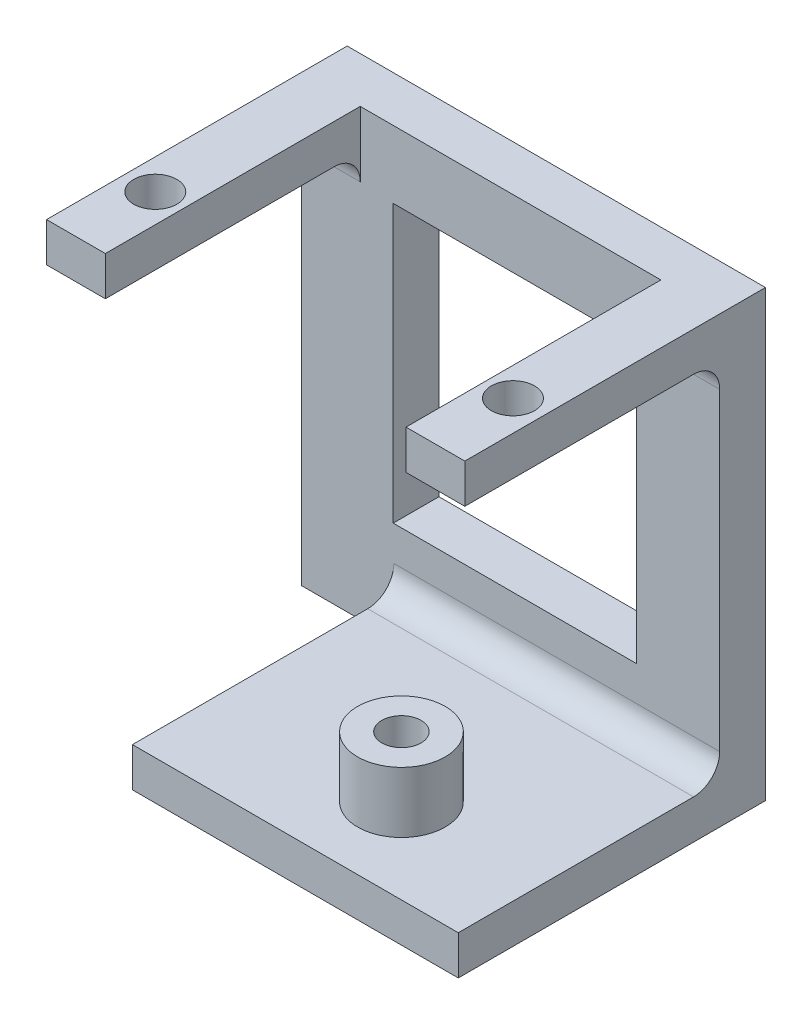
ISO-10303-21;
HEADER;
FILE_DESCRIPTION(('STEP AP214'),'2;1');
FILE_NAME('part.step','',(''),(''),'','','');
FILE_SCHEMA(('AUTOMOTIVE_DESIGN { 1 0 10303 214 1 1 1 1 }'));
ENDSEC;
DATA;
#1=APPLICATION_CONTEXT('core data for automotive mechanical design processes');
#2=APPLICATION_PROTOCOL_DEFINITION('international standard','automotive_design',2000,#1);
#3=PRODUCT_CONTEXT('',#1,'mechanical');
#4=PRODUCT('Part','Part','',(#3));
#5=PRODUCT_RELATED_PRODUCT_CATEGORY('part','',(#4));
#6=PRODUCT_DEFINITION_FORMATION('','',#4);
#7=PRODUCT_DEFINITION_CONTEXT('part definition',#1,'design');
#8=PRODUCT_DEFINITION('design','',#6,#7);
#9=PRODUCT_DEFINITION_SHAPE('','',#8);
#10=(LENGTH_UNIT() NAMED_UNIT(*) SI_UNIT(.MILLI.,.METRE.));
#11=(NAMED_UNIT(*) PLANE_ANGLE_UNIT() SI_UNIT($,.RADIAN.));
#12=(NAMED_UNIT(*) SI_UNIT($,.STERADIAN.) SOLID_ANGLE_UNIT());
#13=UNCERTAINTY_MEASURE_WITH_UNIT(LENGTH_MEASURE(1.E-05),#10,'distance_accuracy_value','');
#14=(GEOMETRIC_REPRESENTATION_CONTEXT(3) GLOBAL_UNCERTAINTY_ASSIGNED_CONTEXT((#13)) GLOBAL_UNIT_ASSIGNED_CONTEXT((#10,
#11,#12)) REPRESENTATION_CONTEXT('',''));
#15=CARTESIAN_POINT('',(0.,0.,0.));
#16=DIRECTION('',(0.,0.,1.));
#17=DIRECTION('',(1.,0.,0.));
#18=AXIS2_PLACEMENT_3D('',#15,#16,#17);
#19=CARTESIAN_POINT('',(16.,-32.5,-13.5));
#20=DIRECTION('',(0.,0.,-1.));
#21=DIRECTION('',(-1.,0.,0.));
#22=AXIS2_PLACEMENT_3D('',#19,#20,#21);
#23=PLANE('',#22);
#24=DIRECTION('',(1.,0.,0.));
#25=VECTOR('',#24,1.);
#26=CARTESIAN_POINT('',(16.,-3.66719670015137,-13.5));
#27=LINE('',#26,#25);
#28=CARTESIAN_POINT('',(-8.97905357841466,-3.66719670015137,-13.5));
#29=VERTEX_POINT('',#28);
#30=CARTESIAN_POINT('',(9.62765777511265,-3.66719670015137,-13.5));
#31=VERTEX_POINT('',#30);
#32=EDGE_CURVE('E393',#29,#31,#27,.T.);
#33=ORIENTED_EDGE('',*,*,#32,.T.);
#34=DIRECTION('',(0.,-1.,0.));
#35=VECTOR('',#34,1.);
#36=CARTESIAN_POINT('',(9.62765777511265,-32.5,-13.5));
#37=LINE('',#36,#35);
#38=CARTESIAN_POINT('',(9.62765777511265,-24.8523813533321,-13.5));
#39=VERTEX_POINT('',#38);
#40=EDGE_CURVE('E396',#31,#39,#37,.T.);
#41=ORIENTED_EDGE('',*,*,#40,.T.);
#42=DIRECTION('',(-1.,0.,0.));
#43=VECTOR('',#42,1.);
#44=CARTESIAN_POINT('',(16.,-24.8523813533321,-13.5));
#45=LINE('',#44,#43);
#46=CARTESIAN_POINT('',(-8.97905357841466,-24.8523813533321,-13.5));
#47=VERTEX_POINT('',#46);
#48=EDGE_CURVE('E387',#39,#47,#45,.T.);
#49=ORIENTED_EDGE('',*,*,#48,.T.);
#50=DIRECTION('',(0.,1.,0.));
#51=VECTOR('',#50,1.);
#52=CARTESIAN_POINT('',(-8.97905357841466,-32.5,-13.5));
#53=LINE('',#52,#51);
#54=EDGE_CURVE('E390',#47,#29,#53,.T.);
#55=ORIENTED_EDGE('',*,*,#54,.T.);
#56=EDGE_LOOP('',(#33,#41,#49,#55));
#57=FACE_BOUND('',#56,.T.);
#58=DIRECTION('',(0.,1.,0.));
#59=VECTOR('',#58,1.);
#60=CARTESIAN_POINT('',(-8.93022142127009,-39.5,-13.5));
#61=LINE('',#60,#59);
#62=CARTESIAN_POINT('',(-8.93022142127009,-32.5,-13.5));
#63=VERTEX_POINT('',#62);
#64=CARTESIAN_POINT('',(-8.93022142127009,-27.5,-13.5));
#65=VERTEX_POINT('',#64);
#66=EDGE_CURVE('E199',#63,#65,#61,.T.);
#67=ORIENTED_EDGE('',*,*,#66,.T.);
#68=DIRECTION('',(-1.,0.,0.));
#69=VECTOR('',#68,1.);
#70=CARTESIAN_POINT('',(16.,-27.5,-13.5));
#71=LINE('',#70,#69);
#72=CARTESIAN_POINT('',(16.,-27.5,-13.5));
#73=VERTEX_POINT('',#72);
#74=EDGE_CURVE('E304',#65,#73,#71,.F.);
#75=ORIENTED_EDGE('',*,*,#74,.T.);
#76=DIRECTION('',(0.,1.,0.));
#77=VECTOR('',#76,1.);
#78=CARTESIAN_POINT('',(16.,-32.5,-13.5));
#79=LINE('',#78,#77);
#80=CARTESIAN_POINT('',(16.,-3.5,-13.5));
#81=VERTEX_POINT('',#80);
#82=EDGE_CURVE('E256',#73,#81,#79,.T.);
#83=ORIENTED_EDGE('',*,*,#82,.T.);
#84=DIRECTION('',(-1.,0.,0.));
#85=VECTOR('',#84,1.);
#86=CARTESIAN_POINT('',(11.5,-3.5,-13.5));
#87=LINE('',#86,#85);
#88=CARTESIAN_POINT('',(11.5,-3.5,-13.5));
#89=VERTEX_POINT('',#88);
#90=EDGE_CURVE('E301',#81,#89,#87,.T.);
#91=ORIENTED_EDGE('',*,*,#90,.T.);
#92=DIRECTION('',(0.,-1.,0.));
#93=VECTOR('',#92,1.);
#94=CARTESIAN_POINT('',(11.5,1.5,-13.5));
#95=LINE('',#94,#93);
#96=CARTESIAN_POINT('',(11.5,1.5,-13.5));
#97=VERTEX_POINT('',#96);
#98=EDGE_CURVE('E216',#97,#89,#95,.T.);
#99=ORIENTED_EDGE('',*,*,#98,.F.);
#100=DIRECTION('',(-1.,0.,0.));
#101=VECTOR('',#100,1.);
#102=CARTESIAN_POINT('',(16.002,1.5,-13.5));
#103=LINE('',#102,#101);
#104=CARTESIAN_POINT('',(-11.5,1.5,-13.5));
#105=VERTEX_POINT('',#104);
#106=EDGE_CURVE('E214',#97,#105,#103,.T.);
#107=ORIENTED_EDGE('',*,*,#106,.T.);
#108=DIRECTION('',(0.,-1.,0.));
#109=VECTOR('',#108,1.);
#110=CARTESIAN_POINT('',(-11.5,1.5,-13.5));
#111=LINE('',#110,#109);
#112=CARTESIAN_POINT('',(-11.5,-3.5,-13.5));
#113=VERTEX_POINT('',#112);
#114=EDGE_CURVE('E207',#105,#113,#111,.T.);
#115=ORIENTED_EDGE('',*,*,#114,.T.);
#116=DIRECTION('',(-1.,0.,0.));
#117=VECTOR('',#116,1.);
#118=CARTESIAN_POINT('',(-16.,-3.5,-13.5));
#119=LINE('',#118,#117);
#120=CARTESIAN_POINT('',(-16.,-3.5,-13.5));
#121=VERTEX_POINT('',#120);
#122=EDGE_CURVE('E298',#113,#121,#119,.T.);
#123=ORIENTED_EDGE('',*,*,#122,.T.);
#124=DIRECTION('',(0.,1.,0.));
#125=VECTOR('',#124,1.);
#126=CARTESIAN_POINT('',(-16.,-32.5,-13.5));
#127=LINE('',#126,#125);
#128=CARTESIAN_POINT('',(-16.,-32.5,-13.5));
#129=VERTEX_POINT('',#128);
#130=EDGE_CURVE('E254',#129,#121,#127,.T.);
#131=ORIENTED_EDGE('',*,*,#130,.F.);
#132=DIRECTION('',(-1.,0.,0.));
#133=VECTOR('',#132,1.);
#134=CARTESIAN_POINT('',(0.,-32.5,-13.5));
#135=LINE('',#134,#133);
#136=EDGE_CURVE('E361',#63,#129,#135,.T.);
#137=ORIENTED_EDGE('',*,*,#136,.F.);
#138=EDGE_LOOP('',(#67,#75,#83,#91,#99,#107,#115,#123,#131,#137));
#139=FACE_BOUND('',#138,.T.);
#140=ADVANCED_FACE('F41',(#57,#139),#23,.F.);
#141=CARTESIAN_POINT('',(-11.5,1.5,-17.));
#142=DIRECTION('',(-1.,0.,0.));
#143=DIRECTION('',(0.,0.,1.));
#144=AXIS2_PLACEMENT_3D('',#141,#142,#143);
#145=PLANE('',#144);
#146=ORIENTED_EDGE('',*,*,#114,.F.);
#147=DIRECTION('',(0.,0.,-1.));
#148=VECTOR('',#147,1.);
#149=CARTESIAN_POINT('',(-11.5,1.5,-17.));
#150=LINE('',#149,#148);
#151=CARTESIAN_POINT('',(-11.5,1.5,6.));
#152=VERTEX_POINT('',#151);
#153=EDGE_CURVE('E272',#152,#105,#150,.T.);
#154=ORIENTED_EDGE('',*,*,#153,.F.);
#155=DIRECTION('',(0.,-1.,0.));
#156=VECTOR('',#155,1.);
#157=CARTESIAN_POINT('',(-11.5,1.5,6.));
#158=LINE('',#157,#156);
#159=CARTESIAN_POINT('',(-11.5,-1.5,6.));
#160=VERTEX_POINT('',#159);
#161=EDGE_CURVE('E284',#152,#160,#158,.T.);
#162=ORIENTED_EDGE('',*,*,#161,.T.);
#163=DIRECTION('',(0.,0.,-1.));
#164=VECTOR('',#163,1.);
#165=CARTESIAN_POINT('',(-11.5,-1.5,-17.));
#166=LINE('',#165,#164);
#167=CARTESIAN_POINT('',(-11.5,-1.5,-11.5));
#168=VERTEX_POINT('',#167);
#169=EDGE_CURVE('E270',#160,#168,#166,.T.);
#170=ORIENTED_EDGE('',*,*,#169,.T.);
#171=CARTESIAN_POINT('',(-11.5,-3.5,-11.5));
#172=DIRECTION('',(-1.,0.,0.));
#173=DIRECTION('',(0.,0.,1.));
#174=AXIS2_PLACEMENT_3D('',#171,#172,#173);
#175=CIRCLE('',#174,2.);
#176=EDGE_CURVE('E11',#168,#113,#175,.T.);
#177=ORIENTED_EDGE('',*,*,#176,.T.);
#178=EDGE_LOOP('',(#146,#154,#162,#170,#177));
#179=FACE_BOUND('',#178,.T.);
#180=ADVANCED_FACE('F348',(#179),#145,.F.);
#181=CARTESIAN_POINT('',(11.5,1.5,-17.));
#182=DIRECTION('',(1.,0.,0.));
#183=DIRECTION('',(0.,0.,-1.));
#184=AXIS2_PLACEMENT_3D('',#181,#182,#183);
#185=PLANE('',#184);
#186=ORIENTED_EDGE('',*,*,#98,.T.);
#187=CARTESIAN_POINT('',(11.5,-3.5,-11.5));
#188=DIRECTION('',(1.,0.,0.));
#189=DIRECTION('',(0.,0.,-1.));
#190=AXIS2_PLACEMENT_3D('',#187,#188,#189);
#191=CIRCLE('',#190,2.);
#192=CARTESIAN_POINT('',(11.5,-1.5,-11.5));
#193=VERTEX_POINT('',#192);
#194=EDGE_CURVE('E313',#89,#193,#191,.T.);
#195=ORIENTED_EDGE('',*,*,#194,.T.);
#196=DIRECTION('',(0.,0.,1.));
#197=VECTOR('',#196,1.);
#198=CARTESIAN_POINT('',(11.5,-1.5,-17.));
#199=LINE('',#198,#197);
#200=CARTESIAN_POINT('',(11.5,-1.5,6.));
#201=VERTEX_POINT('',#200);
#202=EDGE_CURVE('E237',#193,#201,#199,.T.);
#203=ORIENTED_EDGE('',*,*,#202,.T.);
#204=DIRECTION('',(0.,-1.,0.));
#205=VECTOR('',#204,1.);
#206=CARTESIAN_POINT('',(11.5,1.5,6.));
#207=LINE('',#206,#205);
#208=CARTESIAN_POINT('',(11.5,1.5,6.));
#209=VERTEX_POINT('',#208);
#210=EDGE_CURVE('E224',#209,#201,#207,.T.);
#211=ORIENTED_EDGE('',*,*,#210,.F.);
#212=DIRECTION('',(0.,0.,1.));
#213=VECTOR('',#212,1.);
#214=CARTESIAN_POINT('',(11.5,1.5,-17.));
#215=LINE('',#214,#213);
#216=EDGE_CURVE('E235',#97,#209,#215,.T.);
#217=ORIENTED_EDGE('',*,*,#216,.F.);
#218=EDGE_LOOP('',(#186,#195,#203,#211,#217));
#219=FACE_BOUND('',#218,.T.);
#220=ADVANCED_FACE('F332',(#219),#185,.F.);
#221=CARTESIAN_POINT('',(0.,-1.5,0.));
#222=DIRECTION('',(0.,1.,0.));
#223=DIRECTION('',(0.,0.,1.));
#224=AXIS2_PLACEMENT_3D('',#221,#222,#223);
#225=PLANE('',#224);
#226=CARTESIAN_POINT('',(-13.68,-1.5,0.));
#227=DIRECTION('',(0.,1.,0.));
#228=DIRECTION('',(0.,0.,1.));
#229=AXIS2_PLACEMENT_3D('',#226,#227,#228);
#230=CIRCLE('',#229,1.65);
#231=CARTESIAN_POINT('',(-13.68,-1.5,1.65));
#232=VERTEX_POINT('',#231);
#233=EDGE_CURVE('E259',#232,#232,#230,.T.);
#234=ORIENTED_EDGE('',*,*,#233,.T.);
#235=EDGE_LOOP('',(#234));
#236=FACE_BOUND('',#235,.T.);
#237=DIRECTION('',(0.,0.,1.));
#238=VECTOR('',#237,1.);
#239=CARTESIAN_POINT('',(-16.,-1.5,-17.));
#240=LINE('',#239,#238);
#241=CARTESIAN_POINT('',(-16.,-1.5,-11.5));
#242=VERTEX_POINT('',#241);
#243=CARTESIAN_POINT('',(-16.,-1.5,6.));
#244=VERTEX_POINT('',#243);
#245=EDGE_CURVE('E265',#242,#244,#240,.T.);
#246=ORIENTED_EDGE('',*,*,#245,.F.);
#247=DIRECTION('',(-1.,0.,0.));
#248=VECTOR('',#247,1.);
#249=CARTESIAN_POINT('',(-11.5,-1.5,-11.5));
#250=LINE('',#249,#248);
#251=EDGE_CURVE('E62',#242,#168,#250,.F.);
#252=ORIENTED_EDGE('',*,*,#251,.T.);
#253=ORIENTED_EDGE('',*,*,#169,.F.);
#254=DIRECTION('',(1.,0.,0.));
#255=VECTOR('',#254,1.);
#256=CARTESIAN_POINT('',(-16.,-1.5,6.));
#257=LINE('',#256,#255);
#258=EDGE_CURVE('E279',#244,#160,#257,.T.);
#259=ORIENTED_EDGE('',*,*,#258,.F.);
#260=EDGE_LOOP('',(#246,#252,#253,#259));
#261=FACE_BOUND('',#260,.T.);
#262=ADVANCED_FACE('F434',(#236,#261),#225,.F.);
#263=CARTESIAN_POINT('',(-16.,1.5,-17.));
#264=DIRECTION('',(1.,0.,0.));
#265=DIRECTION('',(0.,0.,-1.));
#266=AXIS2_PLACEMENT_3D('',#263,#264,#265);
#267=PLANE('',#266);
#268=DIRECTION('',(0.,0.,-1.));
#269=VECTOR('',#268,1.);
#270=CARTESIAN_POINT('',(-16.,-32.5,-13.5));
#271=LINE('',#270,#269);
#272=CARTESIAN_POINT('',(-16.,-32.5,-17.));
#273=VERTEX_POINT('',#272);
#274=EDGE_CURVE('E247',#129,#273,#271,.T.);
#275=ORIENTED_EDGE('',*,*,#274,.F.);
#276=ORIENTED_EDGE('',*,*,#130,.T.);
#277=CARTESIAN_POINT('',(-16.,-3.5,-11.5));
#278=DIRECTION('',(1.,0.,0.));
#279=DIRECTION('',(0.,0.,-1.));
#280=AXIS2_PLACEMENT_3D('',#277,#278,#279);
#281=CIRCLE('',#280,2.);
#282=EDGE_CURVE('E49',#121,#242,#281,.T.);
#283=ORIENTED_EDGE('',*,*,#282,.T.);
#284=ORIENTED_EDGE('',*,*,#245,.T.);
#285=DIRECTION('',(0.,-1.,0.));
#286=VECTOR('',#285,1.);
#287=CARTESIAN_POINT('',(-16.,1.5,6.));
#288=LINE('',#287,#286);
#289=CARTESIAN_POINT('',(-16.,1.5,6.));
#290=VERTEX_POINT('',#289);
#291=EDGE_CURVE('E287',#290,#244,#288,.T.);
#292=ORIENTED_EDGE('',*,*,#291,.F.);
#293=DIRECTION('',(0.,0.,1.));
#294=VECTOR('',#293,1.);
#295=CARTESIAN_POINT('',(-16.,1.5,-17.));
#296=LINE('',#295,#294);
#297=CARTESIAN_POINT('',(-16.,1.5,-17.));
#298=VERTEX_POINT('',#297);
#299=EDGE_CURVE('E266',#298,#290,#296,.T.);
#300=ORIENTED_EDGE('',*,*,#299,.F.);
#301=DIRECTION('',(0.,-1.,0.));
#302=VECTOR('',#301,1.);
#303=CARTESIAN_POINT('',(-16.,1.5,-17.));
#304=LINE('',#303,#302);
#305=EDGE_CURVE('E277',#298,#273,#304,.T.);
#306=ORIENTED_EDGE('',*,*,#305,.T.);
#307=EDGE_LOOP('',(#275,#276,#283,#284,#292,#300,#306));
#308=FACE_BOUND('',#307,.T.);
#309=ADVANCED_FACE('F354',(#308),#267,.F.);
#310=CARTESIAN_POINT('',(-16.,1.5,6.));
#311=DIRECTION('',(0.,0.,-1.));
#312=DIRECTION('',(-1.,0.,0.));
#313=AXIS2_PLACEMENT_3D('',#310,#311,#312);
#314=PLANE('',#313);
#315=ORIENTED_EDGE('',*,*,#258,.T.);
#316=ORIENTED_EDGE('',*,*,#161,.F.);
#317=DIRECTION('',(1.,0.,0.));
#318=VECTOR('',#317,1.);
#319=CARTESIAN_POINT('',(-16.,1.5,6.));
#320=LINE('',#319,#318);
#321=EDGE_CURVE('E269',#290,#152,#320,.T.);
#322=ORIENTED_EDGE('',*,*,#321,.F.);
#323=ORIENTED_EDGE('',*,*,#291,.T.);
#324=EDGE_LOOP('',(#315,#316,#322,#323));
#325=FACE_BOUND('',#324,.T.);
#326=ADVANCED_FACE('F439',(#325),#314,.F.);
#327=CARTESIAN_POINT('',(-16.,1.5,-17.));
#328=DIRECTION('',(0.,0.,1.));
#329=DIRECTION('',(1.,0.,0.));
#330=AXIS2_PLACEMENT_3D('',#327,#328,#329);
#331=PLANE('',#330);
#332=DIRECTION('',(-1.,0.,0.));
#333=VECTOR('',#332,1.);
#334=CARTESIAN_POINT('',(9.62765777511265,-24.8523813533321,-17.));
#335=LINE('',#334,#333);
#336=CARTESIAN_POINT('',(9.62765777511265,-24.8523813533321,-17.));
#337=VERTEX_POINT('',#336);
#338=CARTESIAN_POINT('',(-8.97905357841466,-24.8523813533321,-17.));
#339=VERTEX_POINT('',#338);
#340=EDGE_CURVE('E364',#337,#339,#335,.T.);
#341=ORIENTED_EDGE('',*,*,#340,.F.);
#342=DIRECTION('',(0.,-1.,0.));
#343=VECTOR('',#342,1.);
#344=CARTESIAN_POINT('',(9.62765777511265,-3.66719670015137,-17.));
#345=LINE('',#344,#343);
#346=CARTESIAN_POINT('',(9.62765777511265,-3.66719670015137,-17.));
#347=VERTEX_POINT('',#346);
#348=EDGE_CURVE('E362',#347,#337,#345,.T.);
#349=ORIENTED_EDGE('',*,*,#348,.F.);
#350=DIRECTION('',(1.,0.,0.));
#351=VECTOR('',#350,1.);
#352=CARTESIAN_POINT('',(9.62765777511265,-3.66719670015137,-17.));
#353=LINE('',#352,#351);
#354=CARTESIAN_POINT('',(-8.97905357841466,-3.66719670015137,-17.));
#355=VERTEX_POINT('',#354);
#356=EDGE_CURVE('E374',#355,#347,#353,.T.);
#357=ORIENTED_EDGE('',*,*,#356,.F.);
#358=DIRECTION('',(0.,1.,0.));
#359=VECTOR('',#358,1.);
#360=CARTESIAN_POINT('',(-8.97905357841466,-3.66719670015137,-17.));
#361=LINE('',#360,#359);
#362=EDGE_CURVE('E371',#339,#355,#361,.T.);
#363=ORIENTED_EDGE('',*,*,#362,.F.);
#364=EDGE_LOOP('',(#341,#349,#357,#363));
#365=FACE_BOUND('',#364,.T.);
#366=DIRECTION('',(-1.,0.,0.));
#367=VECTOR('',#366,1.);
#368=CARTESIAN_POINT('',(-16.,1.5,-17.));
#369=LINE('',#368,#367);
#370=CARTESIAN_POINT('',(16.,1.5,-17.));
#371=VERTEX_POINT('',#370);
#372=EDGE_CURVE('E275',#371,#298,#369,.T.);
#373=ORIENTED_EDGE('',*,*,#372,.F.);
#374=DIRECTION('',(0.,1.,0.));
#375=VECTOR('',#374,1.);
#376=CARTESIAN_POINT('',(16.,-32.5,-17.));
#377=LINE('',#376,#375);
#378=CARTESIAN_POINT('',(16.,-32.5,-17.));
#379=VERTEX_POINT('',#378);
#380=EDGE_CURVE('E251',#379,#371,#377,.T.);
#381=ORIENTED_EDGE('',*,*,#380,.F.);
#382=DIRECTION('',(1.,0.,0.));
#383=VECTOR('',#382,1.);
#384=CARTESIAN_POINT('',(16.,-32.5,-17.));
#385=LINE('',#384,#383);
#386=EDGE_CURVE('E249',#273,#379,#385,.T.);
#387=ORIENTED_EDGE('',*,*,#386,.F.);
#388=ORIENTED_EDGE('',*,*,#305,.F.);
#389=EDGE_LOOP('',(#373,#381,#387,#388));
#390=FACE_BOUND('',#389,.T.);
#391=ADVANCED_FACE('F432',(#365,#390),#331,.F.);
#392=CARTESIAN_POINT('',(0.,1.5,0.));
#393=DIRECTION('',(0.,1.,0.));
#394=DIRECTION('',(0.,0.,1.));
#395=AXIS2_PLACEMENT_3D('',#392,#393,#394);
#396=PLANE('',#395);
#397=CARTESIAN_POINT('',(-13.68,1.5,0.));
#398=DIRECTION('',(0.,1.,0.));
#399=DIRECTION('',(0.,0.,1.));
#400=AXIS2_PLACEMENT_3D('',#397,#398,#399);
#401=CIRCLE('',#400,1.65);
#402=CARTESIAN_POINT('',(-13.68,1.5,1.65));
#403=VERTEX_POINT('',#402);
#404=EDGE_CURVE('E262',#403,#403,#401,.T.);
#405=ORIENTED_EDGE('',*,*,#404,.F.);
#406=EDGE_LOOP('',(#405));
#407=FACE_BOUND('',#406,.T.);
#408=ORIENTED_EDGE('',*,*,#299,.T.);
#409=ORIENTED_EDGE('',*,*,#321,.T.);
#410=ORIENTED_EDGE('',*,*,#153,.T.);
#411=ORIENTED_EDGE('',*,*,#106,.F.);
#412=ORIENTED_EDGE('',*,*,#216,.T.);
#413=DIRECTION('',(1.,0.,0.));
#414=VECTOR('',#413,1.);
#415=CARTESIAN_POINT('',(11.5,1.5,6.));
#416=LINE('',#415,#414);
#417=CARTESIAN_POINT('',(16.,1.5,6.));
#418=VERTEX_POINT('',#417);
#419=EDGE_CURVE('E242',#209,#418,#416,.T.);
#420=ORIENTED_EDGE('',*,*,#419,.T.);
#421=DIRECTION('',(0.,0.,-1.));
#422=VECTOR('',#421,1.);
#423=CARTESIAN_POINT('',(16.,1.5,-17.));
#424=LINE('',#423,#422);
#425=EDGE_CURVE('E230',#418,#371,#424,.T.);
#426=ORIENTED_EDGE('',*,*,#425,.T.);
#427=ORIENTED_EDGE('',*,*,#372,.T.);
#428=EDGE_LOOP('',(#408,#409,#410,#411,#412,#420,#426,#427));
#429=FACE_BOUND('',#428,.T.);
#430=CARTESIAN_POINT('',(13.68,1.5,0.));
#431=DIRECTION('',(0.,1.,0.));
#432=DIRECTION('',(0.,0.,1.));
#433=AXIS2_PLACEMENT_3D('',#430,#431,#432);
#434=CIRCLE('',#433,1.65);
#435=CARTESIAN_POINT('',(13.68,1.5,1.65));
#436=VERTEX_POINT('',#435);
#437=EDGE_CURVE('E218',#436,#436,#434,.T.);
#438=ORIENTED_EDGE('',*,*,#437,.F.);
#439=EDGE_LOOP('',(#438));
#440=FACE_BOUND('',#439,.T.);
#441=ADVANCED_FACE('F343',(#407,#429,#440),#396,.T.);
#442=CARTESIAN_POINT('',(-13.68,-1.5,0.));
#443=DIRECTION('',(0.,1.,0.));
#444=DIRECTION('',(0.,0.,1.));
#445=AXIS2_PLACEMENT_3D('',#442,#443,#444);
#446=CYLINDRICAL_SURFACE('',#445,1.65);
#447=ORIENTED_EDGE('',*,*,#233,.F.);
#448=EDGE_LOOP('',(#447));
#449=FACE_BOUND('',#448,.T.);
#450=ORIENTED_EDGE('',*,*,#404,.T.);
#451=EDGE_LOOP('',(#450));
#452=FACE_BOUND('',#451,.T.);
#453=ADVANCED_FACE('F426',(#449,#452),#446,.F.);
#454=CARTESIAN_POINT('',(16.,-32.5,-13.5));
#455=DIRECTION('',(-1.,0.,0.));
#456=DIRECTION('',(0.,0.,1.));
#457=AXIS2_PLACEMENT_3D('',#454,#455,#456);
#458=PLANE('',#457);
#459=ORIENTED_EDGE('',*,*,#380,.T.);
#460=ORIENTED_EDGE('',*,*,#425,.F.);
#461=DIRECTION('',(0.,-1.,0.));
#462=VECTOR('',#461,1.);
#463=CARTESIAN_POINT('',(16.,1.5,6.));
#464=LINE('',#463,#462);
#465=CARTESIAN_POINT('',(16.,-1.5,6.));
#466=VERTEX_POINT('',#465);
#467=EDGE_CURVE('E227',#418,#466,#464,.T.);
#468=ORIENTED_EDGE('',*,*,#467,.T.);
#469=DIRECTION('',(0.,0.,-1.));
#470=VECTOR('',#469,1.);
#471=CARTESIAN_POINT('',(16.,-1.5,-17.));
#472=LINE('',#471,#470);
#473=CARTESIAN_POINT('',(16.,-1.5,-11.5));
#474=VERTEX_POINT('',#473);
#475=EDGE_CURVE('E231',#466,#474,#472,.T.);
#476=ORIENTED_EDGE('',*,*,#475,.T.);
#477=CARTESIAN_POINT('',(16.,-3.5,-11.5));
#478=DIRECTION('',(-1.,0.,0.));
#479=DIRECTION('',(0.,0.,1.));
#480=AXIS2_PLACEMENT_3D('',#477,#478,#479);
#481=CIRCLE('',#480,2.);
#482=EDGE_CURVE('E315',#474,#81,#481,.T.);
#483=ORIENTED_EDGE('',*,*,#482,.T.);
#484=ORIENTED_EDGE('',*,*,#82,.F.);
#485=CARTESIAN_POINT('',(16.,-27.5,-11.5));
#486=DIRECTION('',(-1.,0.,0.));
#487=DIRECTION('',(0.,0.,1.));
#488=AXIS2_PLACEMENT_3D('',#485,#486,#487);
#489=CIRCLE('',#488,2.);
#490=CARTESIAN_POINT('',(16.,-29.5,-11.5));
#491=VERTEX_POINT('',#490);
#492=EDGE_CURVE('E311',#73,#491,#489,.T.);
#493=ORIENTED_EDGE('',*,*,#492,.T.);
#494=DIRECTION('',(0.,0.,-1.));
#495=VECTOR('',#494,1.);
#496=CARTESIAN_POINT('',(16.,-29.5,6.5));
#497=LINE('',#496,#495);
#498=CARTESIAN_POINT('',(16.,-29.5,6.5));
#499=VERTEX_POINT('',#498);
#500=EDGE_CURVE('E205',#499,#491,#497,.T.);
#501=ORIENTED_EDGE('',*,*,#500,.F.);
#502=DIRECTION('',(0.,1.,0.));
#503=VECTOR('',#502,1.);
#504=CARTESIAN_POINT('',(16.,-29.5,6.5));
#505=LINE('',#504,#503);
#506=CARTESIAN_POINT('',(16.,-32.5,6.5));
#507=VERTEX_POINT('',#506);
#508=EDGE_CURVE('E203',#507,#499,#505,.T.);
#509=ORIENTED_EDGE('',*,*,#508,.F.);
#510=DIRECTION('',(0.,0.,1.));
#511=VECTOR('',#510,1.);
#512=CARTESIAN_POINT('',(16.,-32.5,-13.5));
#513=LINE('',#512,#511);
#514=EDGE_CURVE('E239',#379,#507,#513,.T.);
#515=ORIENTED_EDGE('',*,*,#514,.F.);
#516=EDGE_LOOP('',(#459,#460,#468,#476,#483,#484,#493,#501,#509,#515));
#517=FACE_BOUND('',#516,.T.);
#518=ADVANCED_FACE('F319',(#517),#458,.F.);
#519=CARTESIAN_POINT('',(0.,-32.5,0.));
#520=DIRECTION('',(0.,1.,0.));
#521=DIRECTION('',(0.,0.,1.));
#522=AXIS2_PLACEMENT_3D('',#519,#520,#521);
#523=PLANE('',#522);
#524=CARTESIAN_POINT('',(5.15,-32.5,0.));
#525=DIRECTION('',(0.,1.,0.));
#526=DIRECTION('',(0.,0.,1.));
#527=AXIS2_PLACEMENT_3D('',#524,#525,#526);
#528=CIRCLE('',#527,1.5);
#529=CARTESIAN_POINT('',(5.15,-32.5,1.5));
#530=VERTEX_POINT('',#529);
#531=EDGE_CURVE('E399',#530,#530,#528,.F.);
#532=ORIENTED_EDGE('',*,*,#531,.F.);
#533=EDGE_LOOP('',(#532));
#534=FACE_BOUND('',#533,.T.);
#535=DIRECTION('',(0.,0.,-1.));
#536=VECTOR('',#535,1.);
#537=CARTESIAN_POINT('',(-8.93022142127009,-32.5,0.));
#538=LINE('',#537,#536);
#539=CARTESIAN_POINT('',(-8.93022142127009,-32.5,6.5));
#540=VERTEX_POINT('',#539);
#541=EDGE_CURVE('E185',#540,#63,#538,.T.);
#542=ORIENTED_EDGE('',*,*,#541,.T.);
#543=ORIENTED_EDGE('',*,*,#136,.T.);
#544=ORIENTED_EDGE('',*,*,#274,.T.);
#545=ORIENTED_EDGE('',*,*,#386,.T.);
#546=ORIENTED_EDGE('',*,*,#514,.T.);
#547=DIRECTION('',(1.,0.,0.));
#548=VECTOR('',#547,1.);
#549=CARTESIAN_POINT('',(-16.,-32.5,6.5));
#550=LINE('',#549,#548);
#551=EDGE_CURVE('E209',#540,#507,#550,.T.);
#552=ORIENTED_EDGE('',*,*,#551,.F.);
#553=EDGE_LOOP('',(#542,#543,#544,#545,#546,#552));
#554=FACE_BOUND('',#553,.T.);
#555=ADVANCED_FACE('F359',(#534,#554),#523,.F.);
#556=CARTESIAN_POINT('',(0.,-1.5,0.));
#557=DIRECTION('',(0.,1.,0.));
#558=DIRECTION('',(0.,0.,1.));
#559=AXIS2_PLACEMENT_3D('',#556,#557,#558);
#560=PLANE('',#559);
#561=CARTESIAN_POINT('',(13.68,-1.5,0.));
#562=DIRECTION('',(0.,1.,0.));
#563=DIRECTION('',(0.,0.,1.));
#564=AXIS2_PLACEMENT_3D('',#561,#562,#563);
#565=CIRCLE('',#564,1.65);
#566=CARTESIAN_POINT('',(13.68,-1.5,1.65));
#567=VERTEX_POINT('',#566);
#568=EDGE_CURVE('E221',#567,#567,#565,.T.);
#569=ORIENTED_EDGE('',*,*,#568,.T.);
#570=EDGE_LOOP('',(#569));
#571=FACE_BOUND('',#570,.T.);
#572=ORIENTED_EDGE('',*,*,#202,.F.);
#573=DIRECTION('',(-1.,0.,0.));
#574=VECTOR('',#573,1.);
#575=CARTESIAN_POINT('',(16.,-1.5,-11.5));
#576=LINE('',#575,#574);
#577=EDGE_CURVE('E306',#193,#474,#576,.F.);
#578=ORIENTED_EDGE('',*,*,#577,.T.);
#579=ORIENTED_EDGE('',*,*,#475,.F.);
#580=DIRECTION('',(1.,0.,0.));
#581=VECTOR('',#580,1.);
#582=CARTESIAN_POINT('',(11.5,-1.5,6.));
#583=LINE('',#582,#581);
#584=EDGE_CURVE('E234',#201,#466,#583,.T.);
#585=ORIENTED_EDGE('',*,*,#584,.F.);
#586=EDGE_LOOP('',(#572,#578,#579,#585));
#587=FACE_BOUND('',#586,.T.);
#588=ADVANCED_FACE('F337',(#571,#587),#560,.F.);
#589=CARTESIAN_POINT('',(11.5,1.5,6.));
#590=DIRECTION('',(0.,0.,-1.));
#591=DIRECTION('',(-1.,0.,0.));
#592=AXIS2_PLACEMENT_3D('',#589,#590,#591);
#593=PLANE('',#592);
#594=ORIENTED_EDGE('',*,*,#584,.T.);
#595=ORIENTED_EDGE('',*,*,#467,.F.);
#596=ORIENTED_EDGE('',*,*,#419,.F.);
#597=ORIENTED_EDGE('',*,*,#210,.T.);
#598=EDGE_LOOP('',(#594,#595,#596,#597));
#599=FACE_BOUND('',#598,.T.);
#600=ADVANCED_FACE('F341',(#599),#593,.F.);
#601=CARTESIAN_POINT('',(13.68,-1.5,0.));
#602=DIRECTION('',(0.,1.,0.));
#603=DIRECTION('',(0.,0.,1.));
#604=AXIS2_PLACEMENT_3D('',#601,#602,#603);
#605=CYLINDRICAL_SURFACE('',#604,1.65);
#606=ORIENTED_EDGE('',*,*,#568,.F.);
#607=EDGE_LOOP('',(#606));
#608=FACE_BOUND('',#607,.T.);
#609=ORIENTED_EDGE('',*,*,#437,.T.);
#610=EDGE_LOOP('',(#609));
#611=FACE_BOUND('',#610,.T.);
#612=ADVANCED_FACE('F472',(#608,#611),#605,.F.);
#613=CARTESIAN_POINT('',(-16.,-29.5,6.5));
#614=DIRECTION('',(0.,-1.,0.));
#615=DIRECTION('',(0.,0.,-1.));
#616=AXIS2_PLACEMENT_3D('',#613,#614,#615);
#617=PLANE('',#616);
#618=CARTESIAN_POINT('',(5.15,-29.5,0.));
#619=DIRECTION('',(0.,-1.,0.));
#620=DIRECTION('',(0.,0.,-1.));
#621=AXIS2_PLACEMENT_3D('',#618,#619,#620);
#622=CIRCLE('',#621,3.35);
#623=CARTESIAN_POINT('',(5.15,-29.5,-3.35));
#624=VERTEX_POINT('',#623);
#625=EDGE_CURVE('E190',#624,#624,#622,.F.);
#626=ORIENTED_EDGE('',*,*,#625,.F.);
#627=EDGE_LOOP('',(#626));
#628=FACE_BOUND('',#627,.T.);
#629=ORIENTED_EDGE('',*,*,#500,.T.);
#630=DIRECTION('',(-1.,0.,0.));
#631=VECTOR('',#630,1.);
#632=CARTESIAN_POINT('',(-8.93022142127009,-29.5,-11.5));
#633=LINE('',#632,#631);
#634=CARTESIAN_POINT('',(-8.93022142127009,-29.5,-11.5));
#635=VERTEX_POINT('',#634);
#636=EDGE_CURVE('E189',#491,#635,#633,.T.);
#637=ORIENTED_EDGE('',*,*,#636,.T.);
#638=DIRECTION('',(0.,0.,-1.));
#639=VECTOR('',#638,1.);
#640=CARTESIAN_POINT('',(-8.93022142127009,-29.5,-13.5));
#641=LINE('',#640,#639);
#642=CARTESIAN_POINT('',(-8.93022142127009,-29.5,6.5));
#643=VERTEX_POINT('',#642);
#644=EDGE_CURVE('E182',#643,#635,#641,.T.);
#645=ORIENTED_EDGE('',*,*,#644,.F.);
#646=DIRECTION('',(-1.,0.,0.));
#647=VECTOR('',#646,1.);
#648=CARTESIAN_POINT('',(-16.,-29.5,6.5));
#649=LINE('',#648,#647);
#650=EDGE_CURVE('E197',#499,#643,#649,.T.);
#651=ORIENTED_EDGE('',*,*,#650,.F.);
#652=EDGE_LOOP('',(#629,#637,#645,#651));
#653=FACE_BOUND('',#652,.T.);
#654=ADVANCED_FACE('F196',(#628,#653),#617,.F.);
#655=CARTESIAN_POINT('',(0.,0.,6.5));
#656=DIRECTION('',(0.,0.,1.));
#657=DIRECTION('',(1.,0.,0.));
#658=AXIS2_PLACEMENT_3D('',#655,#656,#657);
#659=PLANE('',#658);
#660=DIRECTION('',(0.,1.,0.));
#661=VECTOR('',#660,1.);
#662=CARTESIAN_POINT('',(-8.93022142127009,0.,6.5));
#663=LINE('',#662,#661);
#664=EDGE_CURVE('E178',#540,#643,#663,.T.);
#665=ORIENTED_EDGE('',*,*,#664,.F.);
#666=ORIENTED_EDGE('',*,*,#551,.T.);
#667=ORIENTED_EDGE('',*,*,#508,.T.);
#668=ORIENTED_EDGE('',*,*,#650,.T.);
#669=EDGE_LOOP('',(#665,#666,#667,#668));
#670=FACE_BOUND('',#669,.T.);
#671=ADVANCED_FACE('F201',(#670),#659,.T.);
#672=CARTESIAN_POINT('',(5.15,-23.5,0.));
#673=DIRECTION('',(0.,-1.,0.));
#674=DIRECTION('',(0.,0.,-1.));
#675=AXIS2_PLACEMENT_3D('',#672,#673,#674);
#676=CYLINDRICAL_SURFACE('',#675,3.35);
#677=CARTESIAN_POINT('',(5.15,-24.8523813533321,0.));
#678=DIRECTION('',(0.,-1.,0.));
#679=DIRECTION('',(0.,0.,-1.));
#680=AXIS2_PLACEMENT_3D('',#677,#678,#679);
#681=CIRCLE('',#680,3.35);
#682=CARTESIAN_POINT('',(5.15,-24.8523813533321,-3.35));
#683=VERTEX_POINT('',#682);
#684=EDGE_CURVE('E294',#683,#683,#681,.T.);
#685=ORIENTED_EDGE('',*,*,#684,.T.);
#686=EDGE_LOOP('',(#685));
#687=FACE_BOUND('',#686,.T.);
#688=ORIENTED_EDGE('',*,*,#625,.T.);
#689=EDGE_LOOP('',(#688));
#690=FACE_BOUND('',#689,.T.);
#691=ADVANCED_FACE('F563',(#687,#690),#676,.T.);
#692=CARTESIAN_POINT('',(5.15,-32.501,0.));
#693=DIRECTION('',(0.,1.,0.));
#694=DIRECTION('',(0.,0.,1.));
#695=AXIS2_PLACEMENT_3D('',#692,#693,#694);
#696=CYLINDRICAL_SURFACE('',#695,1.5);
#697=CARTESIAN_POINT('',(5.15,-24.8523813533321,0.));
#698=DIRECTION('',(0.,-1.,0.));
#699=DIRECTION('',(0.,0.,-1.));
#700=AXIS2_PLACEMENT_3D('',#697,#698,#699);
#701=CIRCLE('',#700,1.5);
#702=CARTESIAN_POINT('',(5.15,-24.8523813533321,-1.5));
#703=VERTEX_POINT('',#702);
#704=EDGE_CURVE('E292',#703,#703,#701,.F.);
#705=ORIENTED_EDGE('',*,*,#704,.T.);
#706=EDGE_LOOP('',(#705));
#707=FACE_BOUND('',#706,.T.);
#708=ORIENTED_EDGE('',*,*,#531,.T.);
#709=EDGE_LOOP('',(#708));
#710=FACE_BOUND('',#709,.T.);
#711=ADVANCED_FACE('F554',(#707,#710),#696,.F.);
#712=CARTESIAN_POINT('',(9.62765777511265,-24.8523813533321,6.5));
#713=DIRECTION('',(0.,-1.,0.));
#714=DIRECTION('',(0.,0.,-1.));
#715=AXIS2_PLACEMENT_3D('',#712,#713,#714);
#716=PLANE('',#715);
#717=ORIENTED_EDGE('',*,*,#704,.F.);
#718=EDGE_LOOP('',(#717));
#719=FACE_BOUND('',#718,.T.);
#720=ORIENTED_EDGE('',*,*,#684,.F.);
#721=EDGE_LOOP('',(#720));
#722=FACE_BOUND('',#721,.T.);
#723=ADVANCED_FACE('F516',(#719,#722),#716,.F.);
#724=CARTESIAN_POINT('',(9.62765777511265,-3.66719670015137,6.5));
#725=DIRECTION('',(1.,0.,0.));
#726=DIRECTION('',(0.,0.,-1.));
#727=AXIS2_PLACEMENT_3D('',#724,#725,#726);
#728=PLANE('',#727);
#729=DIRECTION('',(0.,0.,-1.));
#730=VECTOR('',#729,1.);
#731=CARTESIAN_POINT('',(9.62765777511265,-3.66719670015137,6.5));
#732=LINE('',#731,#730);
#733=EDGE_CURVE('E295',#31,#347,#732,.T.);
#734=ORIENTED_EDGE('',*,*,#733,.T.);
#735=ORIENTED_EDGE('',*,*,#348,.T.);
#736=DIRECTION('',(0.,0.,-1.));
#737=VECTOR('',#736,1.);
#738=CARTESIAN_POINT('',(9.62765777511265,-24.8523813533321,6.5));
#739=LINE('',#738,#737);
#740=EDGE_CURVE('E377',#39,#337,#739,.T.);
#741=ORIENTED_EDGE('',*,*,#740,.F.);
#742=ORIENTED_EDGE('',*,*,#40,.F.);
#743=EDGE_LOOP('',(#734,#735,#741,#742));
#744=FACE_BOUND('',#743,.T.);
#745=ADVANCED_FACE('F535',(#744),#728,.F.);
#746=CARTESIAN_POINT('',(9.62765777511265,-3.66719670015137,6.5));
#747=DIRECTION('',(0.,1.,0.));
#748=DIRECTION('',(0.,0.,1.));
#749=AXIS2_PLACEMENT_3D('',#746,#747,#748);
#750=PLANE('',#749);
#751=DIRECTION('',(0.,0.,-1.));
#752=VECTOR('',#751,1.);
#753=CARTESIAN_POINT('',(-8.97905357841466,-3.66719670015137,6.5));
#754=LINE('',#753,#752);
#755=EDGE_CURVE('E379',#29,#355,#754,.T.);
#756=ORIENTED_EDGE('',*,*,#755,.T.);
#757=ORIENTED_EDGE('',*,*,#356,.T.);
#758=ORIENTED_EDGE('',*,*,#733,.F.);
#759=ORIENTED_EDGE('',*,*,#32,.F.);
#760=EDGE_LOOP('',(#756,#757,#758,#759));
#761=FACE_BOUND('',#760,.T.);
#762=ADVANCED_FACE('F525',(#761),#750,.F.);
#763=CARTESIAN_POINT('',(-8.97905357841466,-3.66719670015137,6.5));
#764=DIRECTION('',(-1.,0.,0.));
#765=DIRECTION('',(0.,0.,1.));
#766=AXIS2_PLACEMENT_3D('',#763,#764,#765);
#767=PLANE('',#766);
#768=DIRECTION('',(0.,0.,-1.));
#769=VECTOR('',#768,1.);
#770=CARTESIAN_POINT('',(-8.97905357841466,-24.8523813533321,6.5));
#771=LINE('',#770,#769);
#772=EDGE_CURVE('E381',#47,#339,#771,.T.);
#773=ORIENTED_EDGE('',*,*,#772,.T.);
#774=ORIENTED_EDGE('',*,*,#362,.T.);
#775=ORIENTED_EDGE('',*,*,#755,.F.);
#776=ORIENTED_EDGE('',*,*,#54,.F.);
#777=EDGE_LOOP('',(#773,#774,#775,#776));
#778=FACE_BOUND('',#777,.T.);
#779=ADVANCED_FACE('F513',(#778),#767,.F.);
#780=ORIENTED_EDGE('',*,*,#740,.T.);
#781=ORIENTED_EDGE('',*,*,#340,.T.);
#782=ORIENTED_EDGE('',*,*,#772,.F.);
#783=ORIENTED_EDGE('',*,*,#48,.F.);
#784=EDGE_LOOP('',(#780,#781,#782,#783));
#785=FACE_BOUND('',#784,.T.);
#786=ADVANCED_FACE('F410',(#785),#716,.F.);
#787=CARTESIAN_POINT('',(-8.93022142127009,-39.5,-13.5));
#788=DIRECTION('',(1.,0.,0.));
#789=DIRECTION('',(0.,0.,-1.));
#790=AXIS2_PLACEMENT_3D('',#787,#788,#789);
#791=PLANE('',#790);
#792=ORIENTED_EDGE('',*,*,#664,.T.);
#793=ORIENTED_EDGE('',*,*,#644,.T.);
#794=CARTESIAN_POINT('',(-8.93022142127009,-27.5,-11.5));
#795=DIRECTION('',(1.,0.,0.));
#796=DIRECTION('',(0.,0.,-1.));
#797=AXIS2_PLACEMENT_3D('',#794,#795,#796);
#798=CIRCLE('',#797,2.);
#799=EDGE_CURVE('E309',#635,#65,#798,.T.);
#800=ORIENTED_EDGE('',*,*,#799,.T.);
#801=ORIENTED_EDGE('',*,*,#66,.F.);
#802=ORIENTED_EDGE('',*,*,#541,.F.);
#803=EDGE_LOOP('',(#792,#793,#800,#801,#802));
#804=FACE_BOUND('',#803,.T.);
#805=ADVANCED_FACE('F180',(#804),#791,.F.);
#806=CARTESIAN_POINT('',(-16.,-27.5,-11.5));
#807=DIRECTION('',(1.,0.,0.));
#808=DIRECTION('',(0.,0.,-1.));
#809=AXIS2_PLACEMENT_3D('',#806,#807,#808);
#810=CYLINDRICAL_SURFACE('',#809,2.);
#811=ORIENTED_EDGE('',*,*,#492,.F.);
#812=ORIENTED_EDGE('',*,*,#74,.F.);
#813=ORIENTED_EDGE('',*,*,#799,.F.);
#814=ORIENTED_EDGE('',*,*,#636,.F.);
#815=EDGE_LOOP('',(#811,#812,#813,#814));
#816=FACE_BOUND('',#815,.T.);
#817=ADVANCED_FACE('F403',(#816),#810,.F.);
#818=CARTESIAN_POINT('',(16.,-3.5,-11.5));
#819=DIRECTION('',(1.,0.,0.));
#820=DIRECTION('',(0.,0.,-1.));
#821=AXIS2_PLACEMENT_3D('',#818,#819,#820);
#822=CYLINDRICAL_SURFACE('',#821,2.);
#823=ORIENTED_EDGE('',*,*,#482,.F.);
#824=ORIENTED_EDGE('',*,*,#577,.F.);
#825=ORIENTED_EDGE('',*,*,#194,.F.);
#826=ORIENTED_EDGE('',*,*,#90,.F.);
#827=EDGE_LOOP('',(#823,#824,#825,#826));
#828=FACE_BOUND('',#827,.T.);
#829=ADVANCED_FACE('F329',(#828),#822,.F.);
#830=CARTESIAN_POINT('',(16.,-3.5,-11.5));
#831=DIRECTION('',(1.,0.,0.));
#832=DIRECTION('',(0.,0.,-1.));
#833=AXIS2_PLACEMENT_3D('',#830,#831,#832);
#834=CYLINDRICAL_SURFACE('',#833,2.);
#835=ORIENTED_EDGE('',*,*,#176,.F.);
#836=ORIENTED_EDGE('',*,*,#251,.F.);
#837=ORIENTED_EDGE('',*,*,#282,.F.);
#838=ORIENTED_EDGE('',*,*,#122,.F.);
#839=EDGE_LOOP('',(#835,#836,#837,#838));
#840=FACE_BOUND('',#839,.T.);
#841=ADVANCED_FACE('F43',(#840),#834,.F.);
#842=CLOSED_SHELL('',(#140,#180,#220,#262,#309,#326,#391,#441,#453,#518,#555,#588,#600,#612,
#654,#671,#691,#711,#723,#745,#762,#779,#786,#805,#817,#829,#841));
#843=MANIFOLD_SOLID_BREP('B2',#842);
#844=ADVANCED_BREP_SHAPE_REPRESENTATION('',(#18,#843),#14);
#845=SHAPE_DEFINITION_REPRESENTATION(#9,#844);
ENDSEC;
END-ISO-10303-21;
